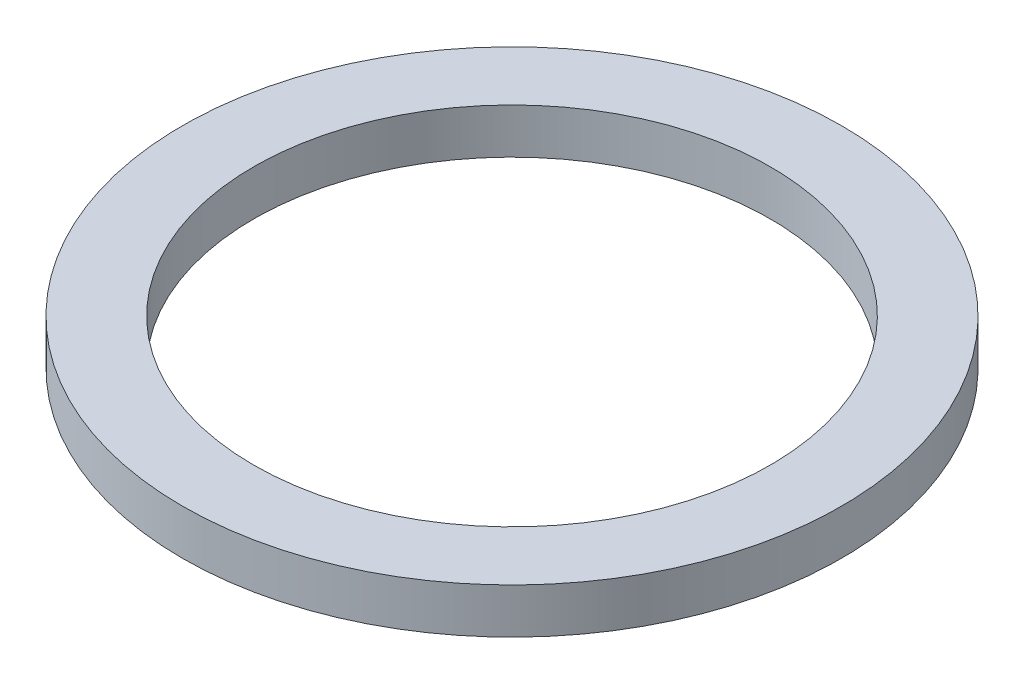
ISO-10303-21;
HEADER;
FILE_DESCRIPTION(('STEP AP214'),'2;1');
FILE_NAME('part.step','',(''),(''),'','','');
FILE_SCHEMA(('AUTOMOTIVE_DESIGN { 1 0 10303 214 1 1 1 1 }'));
ENDSEC;
DATA;
#1=APPLICATION_CONTEXT('core data for automotive mechanical design processes');
#2=APPLICATION_PROTOCOL_DEFINITION('international standard','automotive_design',2000,#1);
#3=PRODUCT_CONTEXT('',#1,'mechanical');
#4=PRODUCT('Part','Part','',(#3));
#5=PRODUCT_RELATED_PRODUCT_CATEGORY('part','',(#4));
#6=PRODUCT_DEFINITION_FORMATION('','',#4);
#7=PRODUCT_DEFINITION_CONTEXT('part definition',#1,'design');
#8=PRODUCT_DEFINITION('design','',#6,#7);
#9=PRODUCT_DEFINITION_SHAPE('','',#8);
#10=(LENGTH_UNIT() NAMED_UNIT(*) SI_UNIT(.MILLI.,.METRE.));
#11=(NAMED_UNIT(*) PLANE_ANGLE_UNIT() SI_UNIT($,.RADIAN.));
#12=(NAMED_UNIT(*) SI_UNIT($,.STERADIAN.) SOLID_ANGLE_UNIT());
#13=UNCERTAINTY_MEASURE_WITH_UNIT(LENGTH_MEASURE(1.E-05),#10,'distance_accuracy_value','');
#14=(GEOMETRIC_REPRESENTATION_CONTEXT(3) GLOBAL_UNCERTAINTY_ASSIGNED_CONTEXT((#13)) GLOBAL_UNIT_ASSIGNED_CONTEXT((#10,
#11,#12)) REPRESENTATION_CONTEXT('',''));
#15=CARTESIAN_POINT('',(0.,0.,0.));
#16=DIRECTION('',(0.,0.,1.));
#17=DIRECTION('',(1.,0.,0.));
#18=AXIS2_PLACEMENT_3D('',#15,#16,#17);
#19=CARTESIAN_POINT('',(0.,3.,0.));
#20=DIRECTION('',(0.,1.,0.));
#21=DIRECTION('',(0.,0.,1.));
#22=AXIS2_PLACEMENT_3D('',#19,#20,#21);
#23=PLANE('',#22);
#24=CARTESIAN_POINT('',(0.,3.,0.));
#25=DIRECTION('',(0.,1.,0.));
#26=DIRECTION('',(0.,0.,1.));
#27=AXIS2_PLACEMENT_3D('',#24,#25,#26);
#28=CIRCLE('',#27,21.875);
#29=CARTESIAN_POINT('',(0.,3.,21.875));
#30=VERTEX_POINT('',#29);
#31=EDGE_CURVE('E10',#30,#30,#28,.T.);
#32=ORIENTED_EDGE('',*,*,#31,.T.);
#33=EDGE_LOOP('',(#32));
#34=FACE_BOUND('',#33,.T.);
#35=CARTESIAN_POINT('',(0.,3.,0.));
#36=DIRECTION('',(0.,1.,0.));
#37=DIRECTION('',(0.,0.,1.));
#38=AXIS2_PLACEMENT_3D('',#35,#36,#37);
#39=CIRCLE('',#38,17.15);
#40=CARTESIAN_POINT('',(0.,3.,17.15));
#41=VERTEX_POINT('',#40);
#42=EDGE_CURVE('E54',#41,#41,#39,.T.);
#43=ORIENTED_EDGE('',*,*,#42,.F.);
#44=EDGE_LOOP('',(#43));
#45=FACE_BOUND('',#44,.T.);
#46=ADVANCED_FACE('F41',(#34,#45),#23,.T.);
#47=CARTESIAN_POINT('',(0.,0.,0.));
#48=DIRECTION('',(0.,1.,0.));
#49=DIRECTION('',(0.,0.,1.));
#50=AXIS2_PLACEMENT_3D('',#47,#48,#49);
#51=PLANE('',#50);
#52=CARTESIAN_POINT('',(0.,0.,0.));
#53=DIRECTION('',(0.,1.,0.));
#54=DIRECTION('',(0.,0.,1.));
#55=AXIS2_PLACEMENT_3D('',#52,#53,#54);
#56=CIRCLE('',#55,21.875);
#57=CARTESIAN_POINT('',(0.,0.,21.875));
#58=VERTEX_POINT('',#57);
#59=EDGE_CURVE('E45',#58,#58,#56,.T.);
#60=ORIENTED_EDGE('',*,*,#59,.F.);
#61=EDGE_LOOP('',(#60));
#62=FACE_BOUND('',#61,.T.);
#63=CARTESIAN_POINT('',(0.,0.,0.));
#64=DIRECTION('',(0.,1.,0.));
#65=DIRECTION('',(0.,0.,1.));
#66=AXIS2_PLACEMENT_3D('',#63,#64,#65);
#67=CIRCLE('',#66,17.15);
#68=CARTESIAN_POINT('',(0.,0.,17.15));
#69=VERTEX_POINT('',#68);
#70=EDGE_CURVE('E56',#69,#69,#67,.T.);
#71=ORIENTED_EDGE('',*,*,#70,.T.);
#72=EDGE_LOOP('',(#71));
#73=FACE_BOUND('',#72,.T.);
#74=ADVANCED_FACE('F68',(#62,#73),#51,.F.);
#75=CARTESIAN_POINT('',(0.,3.,0.));
#76=DIRECTION('',(0.,-1.,0.));
#77=DIRECTION('',(0.,0.,-1.));
#78=AXIS2_PLACEMENT_3D('',#75,#76,#77);
#79=CYLINDRICAL_SURFACE('',#78,21.875);
#80=ORIENTED_EDGE('',*,*,#31,.F.);
#81=EDGE_LOOP('',(#80));
#82=FACE_BOUND('',#81,.T.);
#83=ORIENTED_EDGE('',*,*,#59,.T.);
#84=EDGE_LOOP('',(#83));
#85=FACE_BOUND('',#84,.T.);
#86=ADVANCED_FACE('F43',(#82,#85),#79,.T.);
#87=CARTESIAN_POINT('',(0.,3.,0.));
#88=DIRECTION('',(0.,-1.,0.));
#89=DIRECTION('',(0.,0.,-1.));
#90=AXIS2_PLACEMENT_3D('',#87,#88,#89);
#91=CYLINDRICAL_SURFACE('',#90,17.15);
#92=ORIENTED_EDGE('',*,*,#42,.T.);
#93=EDGE_LOOP('',(#92));
#94=FACE_BOUND('',#93,.T.);
#95=ORIENTED_EDGE('',*,*,#70,.F.);
#96=EDGE_LOOP('',(#95));
#97=FACE_BOUND('',#96,.T.);
#98=ADVANCED_FACE('F64',(#94,#97),#91,.F.);
#99=CLOSED_SHELL('',(#46,#74,#86,#98));
#100=MANIFOLD_SOLID_BREP('B2',#99);
#101=ADVANCED_BREP_SHAPE_REPRESENTATION('',(#18,#100),#14);
#102=SHAPE_DEFINITION_REPRESENTATION(#9,#101);
ENDSEC;
END-ISO-10303-21;
